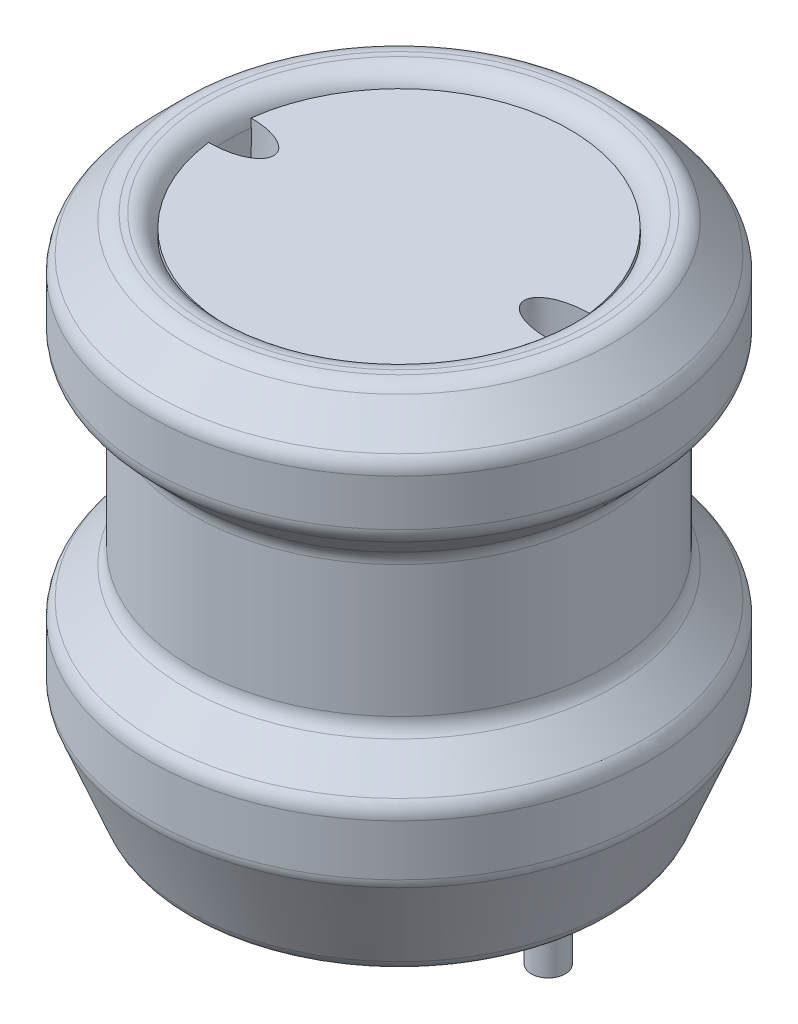
ISO-10303-21;
HEADER;
FILE_DESCRIPTION(('STEP AP214'),'2;1');
FILE_NAME('part.step','',(''),(''),'','','');
FILE_SCHEMA(('AUTOMOTIVE_DESIGN { 1 0 10303 214 1 1 1 1 }'));
ENDSEC;
DATA;
#1=APPLICATION_CONTEXT('core data for automotive mechanical design processes');
#2=APPLICATION_PROTOCOL_DEFINITION('international standard','automotive_design',2000,#1);
#3=PRODUCT_CONTEXT('',#1,'mechanical');
#4=PRODUCT('Part','Part','',(#3));
#5=PRODUCT_RELATED_PRODUCT_CATEGORY('part','',(#4));
#6=PRODUCT_DEFINITION_FORMATION('','',#4);
#7=PRODUCT_DEFINITION_CONTEXT('part definition',#1,'design');
#8=PRODUCT_DEFINITION('design','',#6,#7);
#9=PRODUCT_DEFINITION_SHAPE('','',#8);
#10=(LENGTH_UNIT() NAMED_UNIT(*) SI_UNIT(.MILLI.,.METRE.));
#11=(NAMED_UNIT(*) PLANE_ANGLE_UNIT() SI_UNIT($,.RADIAN.));
#12=(NAMED_UNIT(*) SI_UNIT($,.STERADIAN.) SOLID_ANGLE_UNIT());
#13=UNCERTAINTY_MEASURE_WITH_UNIT(LENGTH_MEASURE(1.E-05),#10,'distance_accuracy_value','');
#14=(GEOMETRIC_REPRESENTATION_CONTEXT(3) GLOBAL_UNCERTAINTY_ASSIGNED_CONTEXT((#13)) GLOBAL_UNIT_ASSIGNED_CONTEXT((#10,
#11,#12)) REPRESENTATION_CONTEXT('',''));
#15=CARTESIAN_POINT('',(0.,0.,0.));
#16=DIRECTION('',(0.,0.,1.));
#17=DIRECTION('',(1.,0.,0.));
#18=AXIS2_PLACEMENT_3D('',#15,#16,#17);
#19=CARTESIAN_POINT('',(0.,12.7,0.));
#20=DIRECTION('',(0.,-1.,0.));
#21=DIRECTION('',(0.,0.,-1.));
#22=AXIS2_PLACEMENT_3D('',#19,#20,#21);
#23=CYLINDRICAL_SURFACE('',#22,4.);
#24=CARTESIAN_POINT('',(0.,11.,0.));
#25=DIRECTION('',(0.,1.,0.));
#26=DIRECTION('',(0.,0.,1.));
#27=AXIS2_PLACEMENT_3D('',#24,#25,#26);
#28=CIRCLE('',#27,4.);
#29=CARTESIAN_POINT('',(0.,11.,4.));
#30=VERTEX_POINT('',#29);
#31=EDGE_CURVE('E137',#30,#30,#28,.T.);
#32=ORIENTED_EDGE('',*,*,#31,.T.);
#33=EDGE_LOOP('',(#32));
#34=FACE_BOUND('',#33,.T.);
#35=DIRECTION('',(0.,-1.,0.));
#36=VECTOR('',#35,1.);
#37=CARTESIAN_POINT('',(3.96865033368978,12.9,-0.499814494491722));
#38=LINE('',#37,#36);
#39=CARTESIAN_POINT('',(3.96865033368978,11.2,-0.499814494491722));
#40=VERTEX_POINT('',#39);
#41=CARTESIAN_POINT('',(3.96865033368978,12.7,-0.499814494491722));
#42=VERTEX_POINT('',#41);
#43=EDGE_CURVE('E60',#40,#42,#38,.F.);
#44=ORIENTED_EDGE('',*,*,#43,.F.);
#45=CARTESIAN_POINT('',(0.,11.2,0.));
#46=DIRECTION('',(0.,-1.,0.));
#47=DIRECTION('',(0.,0.,-1.));
#48=AXIS2_PLACEMENT_3D('',#45,#46,#47);
#49=CIRCLE('',#48,4.);
#50=CARTESIAN_POINT('',(3.96865033368978,11.2,0.499814494491722));
#51=VERTEX_POINT('',#50);
#52=EDGE_CURVE('E12',#40,#51,#49,.T.);
#53=ORIENTED_EDGE('',*,*,#52,.T.);
#54=DIRECTION('',(0.,-1.,0.));
#55=VECTOR('',#54,1.);
#56=CARTESIAN_POINT('',(3.96865033368978,12.9,0.499814494491722));
#57=LINE('',#56,#55);
#58=CARTESIAN_POINT('',(3.96865033368978,12.7,0.499814494491722));
#59=VERTEX_POINT('',#58);
#60=EDGE_CURVE('E93',#59,#51,#57,.T.);
#61=ORIENTED_EDGE('',*,*,#60,.F.);
#62=CARTESIAN_POINT('',(0.,12.7,0.));
#63=DIRECTION('',(0.,1.,0.));
#64=DIRECTION('',(0.,0.,1.));
#65=AXIS2_PLACEMENT_3D('',#62,#63,#64);
#66=CIRCLE('',#65,4.);
#67=CARTESIAN_POINT('',(-3.96865033368978,12.7,0.499814494491723));
#68=VERTEX_POINT('',#67);
#69=EDGE_CURVE('E139',#68,#59,#66,.T.);
#70=ORIENTED_EDGE('',*,*,#69,.F.);
#71=DIRECTION('',(0.,-1.,0.));
#72=VECTOR('',#71,1.);
#73=CARTESIAN_POINT('',(-3.96865033368978,12.9,0.499814494491722));
#74=LINE('',#73,#72);
#75=CARTESIAN_POINT('',(-3.96865033368978,11.2,0.499814494491722));
#76=VERTEX_POINT('',#75);
#77=EDGE_CURVE('E68',#76,#68,#74,.F.);
#78=ORIENTED_EDGE('',*,*,#77,.F.);
#79=CARTESIAN_POINT('',(0.,11.2,0.));
#80=DIRECTION('',(0.,1.,0.));
#81=DIRECTION('',(0.,0.,1.));
#82=AXIS2_PLACEMENT_3D('',#79,#80,#81);
#83=CIRCLE('',#82,4.);
#84=CARTESIAN_POINT('',(-3.96865033368978,11.2,-0.499814494491722));
#85=VERTEX_POINT('',#84);
#86=EDGE_CURVE('E147',#85,#76,#83,.T.);
#87=ORIENTED_EDGE('',*,*,#86,.F.);
#88=DIRECTION('',(0.,-1.,0.));
#89=VECTOR('',#88,1.);
#90=CARTESIAN_POINT('',(-3.96865033368978,12.9,-0.499814494491722));
#91=LINE('',#90,#89);
#92=CARTESIAN_POINT('',(-3.96865033368978,12.7,-0.499814494491722));
#93=VERTEX_POINT('',#92);
#94=EDGE_CURVE('E101',#93,#85,#91,.T.);
#95=ORIENTED_EDGE('',*,*,#94,.F.);
#96=EDGE_CURVE('E97',#42,#93,#66,.T.);
#97=ORIENTED_EDGE('',*,*,#96,.F.);
#98=EDGE_LOOP('',(#44,#53,#61,#70,#78,#87,#95,#97));
#99=FACE_BOUND('',#98,.T.);
#100=ADVANCED_FACE('F46',(#34,#99),#23,.T.);
#101=CARTESIAN_POINT('',(0.,12.7,0.));
#102=DIRECTION('',(0.,1.,0.));
#103=DIRECTION('',(0.,0.,1.));
#104=AXIS2_PLACEMENT_3D('',#101,#102,#103);
#105=PLANE('',#104);
#106=ORIENTED_EDGE('',*,*,#69,.T.);
#107=CARTESIAN_POINT('',(4.,12.7,-0.5));
#108=CARTESIAN_POINT('',(3.,12.7,-0.5));
#109=CARTESIAN_POINT('',(2.5,12.7,0.));
#110=CARTESIAN_POINT('',(3.,12.7,0.5));
#111=CARTESIAN_POINT('',(4.,12.7,0.5));
#112=B_SPLINE_CURVE_WITH_KNOTS('',4,(#107,#108,#109,#110,#111),.UNSPECIFIED.,.F.,.F.,(5,5),(0.,
1.),.UNSPECIFIED.);
#113=EDGE_CURVE('E53',#59,#42,#112,.F.);
#114=ORIENTED_EDGE('',*,*,#113,.T.);
#115=ORIENTED_EDGE('',*,*,#96,.T.);
#116=CARTESIAN_POINT('',(-4.,12.7,0.5));
#117=CARTESIAN_POINT('',(-3.,12.7,0.5));
#118=CARTESIAN_POINT('',(-2.5,12.7,0.));
#119=CARTESIAN_POINT('',(-3.,12.7,-0.5));
#120=CARTESIAN_POINT('',(-4.,12.7,-0.5));
#121=B_SPLINE_CURVE_WITH_KNOTS('',4,(#116,#117,#118,#119,#120),.UNSPECIFIED.,.F.,.F.,(5,5),(0.,
1.),.UNSPECIFIED.);
#122=EDGE_CURVE('E143',#93,#68,#121,.F.);
#123=ORIENTED_EDGE('',*,*,#122,.T.);
#124=EDGE_LOOP('',(#106,#114,#115,#123));
#125=FACE_BOUND('',#124,.T.);
#126=ADVANCED_FACE('F121',(#125),#105,.T.);
#127=CARTESIAN_POINT('',(0.,11.,0.));
#128=DIRECTION('',(0.,1.,0.));
#129=DIRECTION('',(0.,0.,1.));
#130=AXIS2_PLACEMENT_3D('',#127,#128,#129);
#131=PLANE('',#130);
#132=ORIENTED_EDGE('',*,*,#31,.F.);
#133=EDGE_LOOP('',(#132));
#134=FACE_BOUND('',#133,.T.);
#135=ADVANCED_FACE('F123',(#134),#131,.F.);
#136=CARTESIAN_POINT('',(-2.9375,11.2,0.));
#137=DIRECTION('',(0.,1.,0.));
#138=DIRECTION('',(0.,0.,1.));
#139=AXIS2_PLACEMENT_3D('',#136,#137,#138);
#140=PLANE('',#139);
#141=CARTESIAN_POINT('',(-4.,11.2,0.5));
#142=CARTESIAN_POINT('',(-3.,11.2,0.5));
#143=CARTESIAN_POINT('',(-2.5,11.2,0.));
#144=CARTESIAN_POINT('',(-3.,11.2,-0.5));
#145=CARTESIAN_POINT('',(-4.,11.2,-0.5));
#146=B_SPLINE_CURVE_WITH_KNOTS('',4,(#141,#142,#143,#144,#145),.UNSPECIFIED.,.F.,.F.,(5,5),(0.,
1.),.UNSPECIFIED.);
#147=EDGE_CURVE('E98',#76,#85,#146,.T.);
#148=ORIENTED_EDGE('',*,*,#147,.T.);
#149=ORIENTED_EDGE('',*,*,#86,.T.);
#150=EDGE_LOOP('',(#148,#149));
#151=FACE_BOUND('',#150,.T.);
#152=ADVANCED_FACE('F119',(#151),#140,.T.);
#153=CARTESIAN_POINT('',(-4.,12.9,0.5));
#154=CARTESIAN_POINT('',(-3.,12.9,0.5));
#155=CARTESIAN_POINT('',(-2.5,12.9,0.));
#156=CARTESIAN_POINT('',(-3.,12.9,-0.5));
#157=CARTESIAN_POINT('',(-4.,12.9,-0.5));
#158=B_SPLINE_CURVE_WITH_KNOTS('',4,(#153,#154,#155,#156,#157),.UNSPECIFIED.,.F.,.F.,(5,5),(0.,
1.),.UNSPECIFIED.);
#159=DIRECTION('',(0.,-1.,0.));
#160=VECTOR('',#159,1.);
#161=SURFACE_OF_LINEAR_EXTRUSION('',#158,#160);
#162=ORIENTED_EDGE('',*,*,#77,.T.);
#163=ORIENTED_EDGE('',*,*,#122,.F.);
#164=ORIENTED_EDGE('',*,*,#94,.T.);
#165=ORIENTED_EDGE('',*,*,#147,.F.);
#166=EDGE_LOOP('',(#162,#163,#164,#165));
#167=FACE_BOUND('',#166,.T.);
#168=ADVANCED_FACE('F115',(#167),#161,.T.);
#169=CARTESIAN_POINT('',(2.9375,11.2,0.));
#170=DIRECTION('',(0.,-1.,0.));
#171=DIRECTION('',(0.,0.,-1.));
#172=AXIS2_PLACEMENT_3D('',#169,#170,#171);
#173=PLANE('',#172);
#174=CARTESIAN_POINT('',(4.,11.2,-0.5));
#175=CARTESIAN_POINT('',(3.,11.2,-0.5));
#176=CARTESIAN_POINT('',(2.5,11.2,0.));
#177=CARTESIAN_POINT('',(3.,11.2,0.5));
#178=CARTESIAN_POINT('',(4.,11.2,0.5));
#179=B_SPLINE_CURVE_WITH_KNOTS('',4,(#174,#175,#176,#177,#178),.UNSPECIFIED.,.F.,.F.,(5,5),(0.,
1.),.UNSPECIFIED.);
#180=EDGE_CURVE('E89',#40,#51,#179,.T.);
#181=ORIENTED_EDGE('',*,*,#180,.T.);
#182=ORIENTED_EDGE('',*,*,#52,.F.);
#183=EDGE_LOOP('',(#181,#182));
#184=FACE_BOUND('',#183,.T.);
#185=ADVANCED_FACE('F88',(#184),#173,.F.);
#186=CARTESIAN_POINT('',(4.,12.9,-0.5));
#187=CARTESIAN_POINT('',(3.,12.9,-0.5));
#188=CARTESIAN_POINT('',(2.5,12.9,0.));
#189=CARTESIAN_POINT('',(3.,12.9,0.5));
#190=CARTESIAN_POINT('',(4.,12.9,0.5));
#191=B_SPLINE_CURVE_WITH_KNOTS('',4,(#186,#187,#188,#189,#190),.UNSPECIFIED.,.F.,.F.,(5,5),(0.,
1.),.UNSPECIFIED.);
#192=DIRECTION('',(0.,-1.,0.));
#193=VECTOR('',#192,1.);
#194=SURFACE_OF_LINEAR_EXTRUSION('',#191,#193);
#195=ORIENTED_EDGE('',*,*,#43,.T.);
#196=ORIENTED_EDGE('',*,*,#113,.F.);
#197=ORIENTED_EDGE('',*,*,#60,.T.);
#198=ORIENTED_EDGE('',*,*,#180,.F.);
#199=EDGE_LOOP('',(#195,#196,#197,#198));
#200=FACE_BOUND('',#199,.T.);
#201=ADVANCED_FACE('F92',(#200),#194,.T.);
#202=CLOSED_SHELL('',(#100,#126,#135,#152,#168,#185,#201));
#203=MANIFOLD_SOLID_BREP('B2',#202);
#204=CARTESIAN_POINT('',(0.,13.,0.));
#205=DIRECTION('',(0.,-1.,0.));
#206=DIRECTION('',(0.,0.,-1.));
#207=AXIS2_PLACEMENT_3D('',#204,#205,#206);
#208=PLANE('',#207);
#209=CARTESIAN_POINT('',(0.,13.,0.));
#210=DIRECTION('',(0.,-1.,0.));
#211=DIRECTION('',(0.,0.,-1.));
#212=AXIS2_PLACEMENT_3D('',#209,#210,#211);
#213=CIRCLE('',#212,4.64289321881345);
#214=CARTESIAN_POINT('',(0.,13.,-4.64289321881345));
#215=VERTEX_POINT('',#214);
#216=EDGE_CURVE('E247',#215,#215,#213,.F.);
#217=ORIENTED_EDGE('',*,*,#216,.T.);
#218=EDGE_LOOP('',(#217));
#219=FACE_BOUND('',#218,.T.);
#220=CARTESIAN_POINT('',(0.,13.,0.));
#221=DIRECTION('',(0.,-1.,0.));
#222=DIRECTION('',(0.,0.,-1.));
#223=AXIS2_PLACEMENT_3D('',#220,#221,#222);
#224=CIRCLE('',#223,4.5);
#225=CARTESIAN_POINT('',(0.,13.,-4.5));
#226=VERTEX_POINT('',#225);
#227=EDGE_CURVE('E252',#226,#226,#224,.T.);
#228=ORIENTED_EDGE('',*,*,#227,.T.);
#229=EDGE_LOOP('',(#228));
#230=FACE_BOUND('',#229,.T.);
#231=ADVANCED_FACE('F232',(#219,#230),#208,.F.);
#232=CARTESIAN_POINT('',(0.,13.,0.));
#233=DIRECTION('',(0.,-1.,0.));
#234=DIRECTION('',(0.,0.,-1.));
#235=AXIS2_PLACEMENT_3D('',#232,#233,#234);
#236=CONICAL_SURFACE('',#235,4.85,0.785398163397448);
#237=CARTESIAN_POINT('',(0.,12.8535533905933,0.));
#238=DIRECTION('',(0.,1.,0.));
#239=DIRECTION('',(0.,0.,1.));
#240=AXIS2_PLACEMENT_3D('',#237,#238,#239);
#241=CIRCLE('',#240,4.99644660940673);
#242=CARTESIAN_POINT('',(0.,12.8535533905933,4.99644660940673));
#243=VERTEX_POINT('',#242);
#244=EDGE_CURVE('E255',#243,#243,#241,.F.);
#245=ORIENTED_EDGE('',*,*,#244,.T.);
#246=EDGE_LOOP('',(#245));
#247=FACE_BOUND('',#246,.T.);
#248=CARTESIAN_POINT('',(0.,12.1464466094067,0.));
#249=DIRECTION('',(0.,1.,0.));
#250=DIRECTION('',(0.,0.,1.));
#251=AXIS2_PLACEMENT_3D('',#248,#249,#250);
#252=CIRCLE('',#251,5.70355339059327);
#253=CARTESIAN_POINT('',(0.,12.1464466094067,5.70355339059327));
#254=VERTEX_POINT('',#253);
#255=EDGE_CURVE('E258',#254,#254,#252,.T.);
#256=ORIENTED_EDGE('',*,*,#255,.T.);
#257=EDGE_LOOP('',(#256));
#258=FACE_BOUND('',#257,.T.);
#259=ADVANCED_FACE('F315',(#247,#258),#236,.T.);
#260=CARTESIAN_POINT('',(0.,1.,0.));
#261=DIRECTION('',(0.,-1.,0.));
#262=DIRECTION('',(0.,0.,-1.));
#263=AXIS2_PLACEMENT_3D('',#260,#261,#262);
#264=CYLINDRICAL_SURFACE('',#263,5.85);
#265=CARTESIAN_POINT('',(0.,11.7928932188135,0.));
#266=DIRECTION('',(0.,1.,0.));
#267=DIRECTION('',(0.,0.,1.));
#268=AXIS2_PLACEMENT_3D('',#265,#266,#267);
#269=CIRCLE('',#268,5.85);
#270=CARTESIAN_POINT('',(0.,11.7928932188135,5.85));
#271=VERTEX_POINT('',#270);
#272=EDGE_CURVE('E45',#271,#271,#269,.F.);
#273=ORIENTED_EDGE('',*,*,#272,.T.);
#274=EDGE_LOOP('',(#273));
#275=FACE_BOUND('',#274,.T.);
#276=CARTESIAN_POINT('',(0.,10.7071067811865,0.));
#277=DIRECTION('',(0.,1.,0.));
#278=DIRECTION('',(0.,0.,1.));
#279=AXIS2_PLACEMENT_3D('',#276,#277,#278);
#280=CIRCLE('',#279,5.85);
#281=CARTESIAN_POINT('',(0.,10.7071067811865,5.85));
#282=VERTEX_POINT('',#281);
#283=EDGE_CURVE('E239',#282,#282,#280,.T.);
#284=ORIENTED_EDGE('',*,*,#283,.T.);
#285=EDGE_LOOP('',(#284));
#286=FACE_BOUND('',#285,.T.);
#287=ADVANCED_FACE('F321',(#275,#286),#264,.T.);
#288=CARTESIAN_POINT('',(0.,10.5,0.));
#289=DIRECTION('',(0.,1.,0.));
#290=DIRECTION('',(0.,0.,1.));
#291=AXIS2_PLACEMENT_3D('',#288,#289,#290);
#292=CONICAL_SURFACE('',#291,5.85,0.785398163397448);
#293=CARTESIAN_POINT('',(0.,9.64644660940673,0.));
#294=DIRECTION('',(0.,1.,0.));
#295=DIRECTION('',(0.,0.,1.));
#296=AXIS2_PLACEMENT_3D('',#293,#294,#295);
#297=CIRCLE('',#296,4.99644660940672);
#298=CARTESIAN_POINT('',(0.,9.64644660940673,4.99644660940672));
#299=VERTEX_POINT('',#298);
#300=EDGE_CURVE('E267',#299,#299,#297,.T.);
#301=ORIENTED_EDGE('',*,*,#300,.T.);
#302=EDGE_LOOP('',(#301));
#303=FACE_BOUND('',#302,.T.);
#304=CARTESIAN_POINT('',(0.,10.3535533905933,0.));
#305=DIRECTION('',(0.,-1.,0.));
#306=DIRECTION('',(0.,0.,-1.));
#307=AXIS2_PLACEMENT_3D('',#304,#305,#306);
#308=CIRCLE('',#307,5.70355339059327);
#309=CARTESIAN_POINT('',(0.,10.3535533905933,-5.70355339059327));
#310=VERTEX_POINT('',#309);
#311=EDGE_CURVE('E270',#310,#310,#308,.T.);
#312=ORIENTED_EDGE('',*,*,#311,.T.);
#313=EDGE_LOOP('',(#312));
#314=FACE_BOUND('',#313,.T.);
#315=ADVANCED_FACE('F363',(#303,#314),#292,.T.);
#316=CARTESIAN_POINT('',(0.,1.,0.));
#317=DIRECTION('',(0.,-1.,0.));
#318=DIRECTION('',(0.,0.,-1.));
#319=AXIS2_PLACEMENT_3D('',#316,#317,#318);
#320=CYLINDRICAL_SURFACE('',#319,4.85);
#321=CARTESIAN_POINT('',(0.,9.29289321881345,0.));
#322=DIRECTION('',(0.,-1.,0.));
#323=DIRECTION('',(0.,0.,-1.));
#324=AXIS2_PLACEMENT_3D('',#321,#322,#323);
#325=CIRCLE('',#324,4.85);
#326=CARTESIAN_POINT('',(0.,9.29289321881345,-4.85));
#327=VERTEX_POINT('',#326);
#328=EDGE_CURVE('E273',#327,#327,#325,.T.);
#329=ORIENTED_EDGE('',*,*,#328,.T.);
#330=EDGE_LOOP('',(#329));
#331=FACE_BOUND('',#330,.T.);
#332=CARTESIAN_POINT('',(0.,6.20710678118655,0.));
#333=DIRECTION('',(0.,-1.,0.));
#334=DIRECTION('',(0.,0.,-1.));
#335=AXIS2_PLACEMENT_3D('',#332,#333,#334);
#336=CIRCLE('',#335,4.85);
#337=CARTESIAN_POINT('',(0.,6.20710678118655,-4.85));
#338=VERTEX_POINT('',#337);
#339=EDGE_CURVE('E276',#338,#338,#336,.F.);
#340=ORIENTED_EDGE('',*,*,#339,.T.);
#341=EDGE_LOOP('',(#340));
#342=FACE_BOUND('',#341,.T.);
#343=ADVANCED_FACE('F365',(#331,#342),#320,.T.);
#344=CARTESIAN_POINT('',(0.,6.,0.));
#345=DIRECTION('',(0.,-1.,0.));
#346=DIRECTION('',(0.,0.,-1.));
#347=AXIS2_PLACEMENT_3D('',#344,#345,#346);
#348=CONICAL_SURFACE('',#347,4.85,0.785398163397449);
#349=CARTESIAN_POINT('',(0.,5.85355339059327,0.));
#350=DIRECTION('',(0.,-1.,0.));
#351=DIRECTION('',(0.,0.,-1.));
#352=AXIS2_PLACEMENT_3D('',#349,#350,#351);
#353=CIRCLE('',#352,4.99644660940673);
#354=CARTESIAN_POINT('',(0.,5.85355339059327,-4.99644660940673));
#355=VERTEX_POINT('',#354);
#356=EDGE_CURVE('E261',#355,#355,#353,.T.);
#357=ORIENTED_EDGE('',*,*,#356,.T.);
#358=EDGE_LOOP('',(#357));
#359=FACE_BOUND('',#358,.T.);
#360=CARTESIAN_POINT('',(0.,5.14644660940673,0.));
#361=DIRECTION('',(0.,1.,0.));
#362=DIRECTION('',(0.,0.,1.));
#363=AXIS2_PLACEMENT_3D('',#360,#361,#362);
#364=CIRCLE('',#363,5.70355339059327);
#365=CARTESIAN_POINT('',(0.,5.14644660940673,5.70355339059327));
#366=VERTEX_POINT('',#365);
#367=EDGE_CURVE('E264',#366,#366,#364,.T.);
#368=ORIENTED_EDGE('',*,*,#367,.T.);
#369=EDGE_LOOP('',(#368));
#370=FACE_BOUND('',#369,.T.);
#371=ADVANCED_FACE('F372',(#359,#370),#348,.T.);
#372=CARTESIAN_POINT('',(0.,1.,0.));
#373=DIRECTION('',(0.,-1.,0.));
#374=DIRECTION('',(0.,0.,-1.));
#375=AXIS2_PLACEMENT_3D('',#372,#373,#374);
#376=CYLINDRICAL_SURFACE('',#375,5.85);
#377=CARTESIAN_POINT('',(0.,3.59629120178362,0.));
#378=DIRECTION('',(0.,1.,0.));
#379=DIRECTION('',(0.,0.,1.));
#380=AXIS2_PLACEMENT_3D('',#377,#378,#379);
#381=CIRCLE('',#380,5.85);
#382=CARTESIAN_POINT('',(0.,3.59629120178362,5.85));
#383=VERTEX_POINT('',#382);
#384=EDGE_CURVE('E282',#383,#383,#381,.T.);
#385=ORIENTED_EDGE('',*,*,#384,.T.);
#386=EDGE_LOOP('',(#385));
#387=FACE_BOUND('',#386,.T.);
#388=CARTESIAN_POINT('',(0.,4.79289321881345,0.));
#389=DIRECTION('',(0.,1.,0.));
#390=DIRECTION('',(0.,0.,1.));
#391=AXIS2_PLACEMENT_3D('',#388,#389,#390);
#392=CIRCLE('',#391,5.85);
#393=CARTESIAN_POINT('',(0.,4.79289321881345,5.85));
#394=VERTEX_POINT('',#393);
#395=EDGE_CURVE('E285',#394,#394,#392,.F.);
#396=ORIENTED_EDGE('',*,*,#395,.T.);
#397=EDGE_LOOP('',(#396));
#398=FACE_BOUND('',#397,.T.);
#399=ADVANCED_FACE('F378',(#387,#398),#376,.T.);
#400=CARTESIAN_POINT('',(0.,3.5,0.));
#401=DIRECTION('',(0.,1.,0.));
#402=DIRECTION('',(0.,0.,1.));
#403=AXIS2_PLACEMENT_3D('',#400,#401,#402);
#404=CONICAL_SURFACE('',#403,5.85,0.380506377112365);
#405=CARTESIAN_POINT('',(0.,3.41059586360657,0.));
#406=DIRECTION('',(0.,-1.,0.));
#407=DIRECTION('',(0.,0.,-1.));
#408=AXIS2_PLACEMENT_3D('',#405,#406,#407);
#409=CIRCLE('',#408,5.81423834544263);
#410=CARTESIAN_POINT('',(0.,3.41059586360657,-5.81423834544263));
#411=VERTEX_POINT('',#410);
#412=EDGE_CURVE('E288',#411,#411,#409,.T.);
#413=ORIENTED_EDGE('',*,*,#412,.T.);
#414=EDGE_LOOP('',(#413));
#415=FACE_BOUND('',#414,.T.);
#416=CARTESIAN_POINT('',(0.,1.31430466182295,0.));
#417=DIRECTION('',(0.,-1.,0.));
#418=DIRECTION('',(0.,0.,-1.));
#419=AXIS2_PLACEMENT_3D('',#416,#417,#418);
#420=CIRCLE('',#419,4.97572186472918);
#421=CARTESIAN_POINT('',(0.,1.31430466182295,-4.97572186472918));
#422=VERTEX_POINT('',#421);
#423=EDGE_CURVE('E291',#422,#422,#420,.F.);
#424=ORIENTED_EDGE('',*,*,#423,.T.);
#425=EDGE_LOOP('',(#424));
#426=FACE_BOUND('',#425,.T.);
#427=ADVANCED_FACE('F311',(#415,#426),#404,.T.);
#428=CARTESIAN_POINT('',(-4.85,1.,0.));
#429=DIRECTION('',(0.,1.,0.));
#430=DIRECTION('',(0.,0.,1.));
#431=AXIS2_PLACEMENT_3D('',#428,#429,#430);
#432=PLANE('',#431);
#433=CARTESIAN_POINT('',(0.,1.,0.));
#434=DIRECTION('',(0.,1.,0.));
#435=DIRECTION('',(0.,0.,1.));
#436=AXIS2_PLACEMENT_3D('',#433,#434,#435);
#437=CIRCLE('',#436,4.51148351928655);
#438=CARTESIAN_POINT('',(0.,1.,4.51148351928655));
#439=VERTEX_POINT('',#438);
#440=EDGE_CURVE('E279',#439,#439,#437,.F.);
#441=ORIENTED_EDGE('',*,*,#440,.T.);
#442=EDGE_LOOP('',(#441));
#443=FACE_BOUND('',#442,.T.);
#444=ADVANCED_FACE('F302',(#443),#432,.F.);
#445=CARTESIAN_POINT('',(0.,14.,0.));
#446=DIRECTION('',(0.,-1.,0.));
#447=DIRECTION('',(0.,0.,-1.));
#448=AXIS2_PLACEMENT_3D('',#445,#446,#447);
#449=CYLINDRICAL_SURFACE('',#448,4.);
#450=CARTESIAN_POINT('',(0.,12.5,0.));
#451=DIRECTION('',(0.,-1.,0.));
#452=DIRECTION('',(0.,0.,-1.));
#453=AXIS2_PLACEMENT_3D('',#450,#451,#452);
#454=CIRCLE('',#453,4.);
#455=CARTESIAN_POINT('',(0.,12.5,-4.));
#456=VERTEX_POINT('',#455);
#457=EDGE_CURVE('E243',#456,#456,#454,.F.);
#458=ORIENTED_EDGE('',*,*,#457,.T.);
#459=EDGE_LOOP('',(#458));
#460=FACE_BOUND('',#459,.T.);
#461=CARTESIAN_POINT('',(0.,11.,0.));
#462=DIRECTION('',(0.,1.,0.));
#463=DIRECTION('',(0.,0.,1.));
#464=AXIS2_PLACEMENT_3D('',#461,#462,#463);
#465=CIRCLE('',#464,4.);
#466=CARTESIAN_POINT('',(0.,11.,4.));
#467=VERTEX_POINT('',#466);
#468=EDGE_CURVE('E294',#467,#467,#465,.T.);
#469=ORIENTED_EDGE('',*,*,#468,.F.);
#470=EDGE_LOOP('',(#469));
#471=FACE_BOUND('',#470,.T.);
#472=ADVANCED_FACE('F300',(#460,#471),#449,.F.);
#473=CARTESIAN_POINT('',(0.,11.,0.));
#474=DIRECTION('',(0.,1.,0.));
#475=DIRECTION('',(0.,0.,1.));
#476=AXIS2_PLACEMENT_3D('',#473,#474,#475);
#477=PLANE('',#476);
#478=ORIENTED_EDGE('',*,*,#468,.T.);
#479=EDGE_LOOP('',(#478));
#480=FACE_BOUND('',#479,.T.);
#481=ADVANCED_FACE('F298',(#480),#477,.T.);
#482=CARTESIAN_POINT('',(0.,3.59629120178362,0.));
#483=DIRECTION('',(0.,1.,0.));
#484=DIRECTION('',(0.,0.,1.));
#485=AXIS2_PLACEMENT_3D('',#482,#483,#484);
#486=TOROIDAL_SURFACE('',#485,5.35,0.5);
#487=ORIENTED_EDGE('',*,*,#384,.F.);
#488=EDGE_LOOP('',(#487));
#489=FACE_BOUND('',#488,.T.);
#490=ORIENTED_EDGE('',*,*,#412,.F.);
#491=EDGE_LOOP('',(#490));
#492=FACE_BOUND('',#491,.T.);
#493=ADVANCED_FACE('F309',(#489,#492),#486,.T.);
#494=CARTESIAN_POINT('',(0.,1.5,0.));
#495=DIRECTION('',(0.,1.,0.));
#496=DIRECTION('',(0.,0.,1.));
#497=AXIS2_PLACEMENT_3D('',#494,#495,#496);
#498=TOROIDAL_SURFACE('',#497,4.51148351928655,0.5);
#499=ORIENTED_EDGE('',*,*,#423,.F.);
#500=EDGE_LOOP('',(#499));
#501=FACE_BOUND('',#500,.T.);
#502=ORIENTED_EDGE('',*,*,#440,.F.);
#503=EDGE_LOOP('',(#502));
#504=FACE_BOUND('',#503,.T.);
#505=ADVANCED_FACE('F329',(#501,#504),#498,.T.);
#506=CARTESIAN_POINT('',(0.,9.29289321881345,0.));
#507=DIRECTION('',(0.,-1.,0.));
#508=DIRECTION('',(0.,0.,-1.));
#509=AXIS2_PLACEMENT_3D('',#506,#507,#508);
#510=TOROIDAL_SURFACE('',#509,5.35,0.5);
#511=ORIENTED_EDGE('',*,*,#300,.F.);
#512=EDGE_LOOP('',(#511));
#513=FACE_BOUND('',#512,.T.);
#514=ORIENTED_EDGE('',*,*,#328,.F.);
#515=EDGE_LOOP('',(#514));
#516=FACE_BOUND('',#515,.T.);
#517=ADVANCED_FACE('F333',(#513,#516),#510,.F.);
#518=CARTESIAN_POINT('',(0.,6.20710678118655,0.));
#519=DIRECTION('',(0.,-1.,0.));
#520=DIRECTION('',(0.,0.,-1.));
#521=AXIS2_PLACEMENT_3D('',#518,#519,#520);
#522=TOROIDAL_SURFACE('',#521,5.35,0.5);
#523=ORIENTED_EDGE('',*,*,#339,.F.);
#524=EDGE_LOOP('',(#523));
#525=FACE_BOUND('',#524,.T.);
#526=ORIENTED_EDGE('',*,*,#356,.F.);
#527=EDGE_LOOP('',(#526));
#528=FACE_BOUND('',#527,.T.);
#529=ADVANCED_FACE('F337',(#525,#528),#522,.F.);
#530=CARTESIAN_POINT('',(0.,12.5,0.));
#531=DIRECTION('',(0.,-1.,0.));
#532=DIRECTION('',(0.,0.,-1.));
#533=AXIS2_PLACEMENT_3D('',#530,#531,#532);
#534=TOROIDAL_SURFACE('',#533,4.64289321881345,0.5);
#535=ORIENTED_EDGE('',*,*,#216,.F.);
#536=EDGE_LOOP('',(#535));
#537=FACE_BOUND('',#536,.T.);
#538=ORIENTED_EDGE('',*,*,#244,.F.);
#539=EDGE_LOOP('',(#538));
#540=FACE_BOUND('',#539,.T.);
#541=ADVANCED_FACE('F341',(#537,#540),#534,.T.);
#542=CARTESIAN_POINT('',(0.,12.5,0.));
#543=DIRECTION('',(0.,-1.,0.));
#544=DIRECTION('',(0.,0.,-1.));
#545=AXIS2_PLACEMENT_3D('',#542,#543,#544);
#546=TOROIDAL_SURFACE('',#545,4.5,0.5);
#547=ORIENTED_EDGE('',*,*,#227,.F.);
#548=EDGE_LOOP('',(#547));
#549=FACE_BOUND('',#548,.T.);
#550=ORIENTED_EDGE('',*,*,#457,.F.);
#551=EDGE_LOOP('',(#550));
#552=FACE_BOUND('',#551,.T.);
#553=ADVANCED_FACE('F345',(#549,#552),#546,.T.);
#554=CARTESIAN_POINT('',(0.,11.7928932188135,0.));
#555=DIRECTION('',(0.,1.,0.));
#556=DIRECTION('',(0.,0.,1.));
#557=AXIS2_PLACEMENT_3D('',#554,#555,#556);
#558=TOROIDAL_SURFACE('',#557,5.35,0.5);
#559=ORIENTED_EDGE('',*,*,#255,.F.);
#560=EDGE_LOOP('',(#559));
#561=FACE_BOUND('',#560,.T.);
#562=ORIENTED_EDGE('',*,*,#272,.F.);
#563=EDGE_LOOP('',(#562));
#564=FACE_BOUND('',#563,.T.);
#565=ADVANCED_FACE('F349',(#561,#564),#558,.T.);
#566=CARTESIAN_POINT('',(0.,10.7071067811865,0.));
#567=DIRECTION('',(0.,1.,0.));
#568=DIRECTION('',(0.,0.,1.));
#569=AXIS2_PLACEMENT_3D('',#566,#567,#568);
#570=TOROIDAL_SURFACE('',#569,5.35,0.5);
#571=ORIENTED_EDGE('',*,*,#283,.F.);
#572=EDGE_LOOP('',(#571));
#573=FACE_BOUND('',#572,.T.);
#574=ORIENTED_EDGE('',*,*,#311,.F.);
#575=EDGE_LOOP('',(#574));
#576=FACE_BOUND('',#575,.T.);
#577=ADVANCED_FACE('F352',(#573,#576),#570,.T.);
#578=CARTESIAN_POINT('',(0.,4.79289321881345,0.));
#579=DIRECTION('',(0.,1.,0.));
#580=DIRECTION('',(0.,0.,1.));
#581=AXIS2_PLACEMENT_3D('',#578,#579,#580);
#582=TOROIDAL_SURFACE('',#581,5.35,0.5);
#583=ORIENTED_EDGE('',*,*,#367,.F.);
#584=EDGE_LOOP('',(#583));
#585=FACE_BOUND('',#584,.T.);
#586=ORIENTED_EDGE('',*,*,#395,.F.);
#587=EDGE_LOOP('',(#586));
#588=FACE_BOUND('',#587,.T.);
#589=ADVANCED_FACE('F234',(#585,#588),#582,.T.);
#590=CLOSED_SHELL('',(#231,#259,#287,#315,#343,#371,#399,#427,#444,#472,#481,#493,#505,#517,
#529,#541,#553,#565,#577,#589));
#591=MANIFOLD_SOLID_BREP('B6',#590);
#592=CARTESIAN_POINT('',(3.5,1.,0.));
#593=DIRECTION('',(0.,-1.,0.));
#594=DIRECTION('',(0.,0.,-1.));
#595=AXIS2_PLACEMENT_3D('',#592,#593,#594);
#596=CYLINDRICAL_SURFACE('',#595,0.4);
#597=CARTESIAN_POINT('',(3.5,1.,0.));
#598=DIRECTION('',(0.,1.,0.));
#599=DIRECTION('',(0.,0.,1.));
#600=AXIS2_PLACEMENT_3D('',#597,#598,#599);
#601=CIRCLE('',#600,0.4);
#602=CARTESIAN_POINT('',(3.5,1.,0.4));
#603=VERTEX_POINT('',#602);
#604=EDGE_CURVE('E231',#603,#603,#601,.T.);
#605=ORIENTED_EDGE('',*,*,#604,.F.);
#606=EDGE_LOOP('',(#605));
#607=FACE_BOUND('',#606,.T.);
#608=CARTESIAN_POINT('',(3.5,-0.5,0.));
#609=DIRECTION('',(0.,1.,0.));
#610=DIRECTION('',(0.,0.,1.));
#611=AXIS2_PLACEMENT_3D('',#608,#609,#610);
#612=CIRCLE('',#611,0.4);
#613=CARTESIAN_POINT('',(3.5,-0.5,0.4));
#614=VERTEX_POINT('',#613);
#615=EDGE_CURVE('E540',#614,#614,#612,.T.);
#616=ORIENTED_EDGE('',*,*,#615,.T.);
#617=EDGE_LOOP('',(#616));
#618=FACE_BOUND('',#617,.T.);
#619=ADVANCED_FACE('F537',(#607,#618),#596,.T.);
#620=CARTESIAN_POINT('',(3.5,1.,0.));
#621=DIRECTION('',(0.,1.,0.));
#622=DIRECTION('',(0.,0.,1.));
#623=AXIS2_PLACEMENT_3D('',#620,#621,#622);
#624=PLANE('',#623);
#625=ORIENTED_EDGE('',*,*,#604,.T.);
#626=EDGE_LOOP('',(#625));
#627=FACE_BOUND('',#626,.T.);
#628=ADVANCED_FACE('F552',(#627),#624,.T.);
#629=CARTESIAN_POINT('',(3.5,-0.5,0.));
#630=DIRECTION('',(0.,1.,0.));
#631=DIRECTION('',(0.,0.,1.));
#632=AXIS2_PLACEMENT_3D('',#629,#630,#631);
#633=PLANE('',#632);
#634=ORIENTED_EDGE('',*,*,#615,.F.);
#635=EDGE_LOOP('',(#634));
#636=FACE_BOUND('',#635,.T.);
#637=ADVANCED_FACE('F550',(#636),#633,.F.);
#638=CLOSED_SHELL('',(#619,#628,#637));
#639=MANIFOLD_SOLID_BREP('B40',#638);
#640=CARTESIAN_POINT('',(-3.5,1.,0.));
#641=DIRECTION('',(0.,-1.,0.));
#642=DIRECTION('',(0.,0.,-1.));
#643=AXIS2_PLACEMENT_3D('',#640,#641,#642);
#644=CYLINDRICAL_SURFACE('',#643,0.4);
#645=CARTESIAN_POINT('',(-3.5,1.,0.));
#646=DIRECTION('',(0.,1.,0.));
#647=DIRECTION('',(0.,0.,1.));
#648=AXIS2_PLACEMENT_3D('',#645,#646,#647);
#649=CIRCLE('',#648,0.4);
#650=CARTESIAN_POINT('',(-3.5,1.,0.4));
#651=VERTEX_POINT('',#650);
#652=EDGE_CURVE('E536',#651,#651,#649,.T.);
#653=ORIENTED_EDGE('',*,*,#652,.F.);
#654=EDGE_LOOP('',(#653));
#655=FACE_BOUND('',#654,.T.);
#656=CARTESIAN_POINT('',(-3.5,-0.5,0.));
#657=DIRECTION('',(0.,1.,0.));
#658=DIRECTION('',(0.,0.,1.));
#659=AXIS2_PLACEMENT_3D('',#656,#657,#658);
#660=CIRCLE('',#659,0.4);
#661=CARTESIAN_POINT('',(-3.5,-0.5,0.4));
#662=VERTEX_POINT('',#661);
#663=EDGE_CURVE('E580',#662,#662,#660,.T.);
#664=ORIENTED_EDGE('',*,*,#663,.T.);
#665=EDGE_LOOP('',(#664));
#666=FACE_BOUND('',#665,.T.);
#667=ADVANCED_FACE('F577',(#655,#666),#644,.T.);
#668=CARTESIAN_POINT('',(-3.5,1.,0.));
#669=DIRECTION('',(0.,1.,0.));
#670=DIRECTION('',(0.,0.,1.));
#671=AXIS2_PLACEMENT_3D('',#668,#669,#670);
#672=PLANE('',#671);
#673=ORIENTED_EDGE('',*,*,#652,.T.);
#674=EDGE_LOOP('',(#673));
#675=FACE_BOUND('',#674,.T.);
#676=ADVANCED_FACE('F592',(#675),#672,.T.);
#677=CARTESIAN_POINT('',(-3.5,-0.5,0.));
#678=DIRECTION('',(0.,1.,0.));
#679=DIRECTION('',(0.,0.,1.));
#680=AXIS2_PLACEMENT_3D('',#677,#678,#679);
#681=PLANE('',#680);
#682=ORIENTED_EDGE('',*,*,#663,.F.);
#683=EDGE_LOOP('',(#682));
#684=FACE_BOUND('',#683,.T.);
#685=ADVANCED_FACE('F590',(#684),#681,.F.);
#686=CLOSED_SHELL('',(#667,#676,#685));
#687=MANIFOLD_SOLID_BREP('B226',#686);
#688=ADVANCED_BREP_SHAPE_REPRESENTATION('',(#18,#203,#591,#639,#687),#14);
#689=SHAPE_DEFINITION_REPRESENTATION(#9,#688);
ENDSEC;
END-ISO-10303-21;
